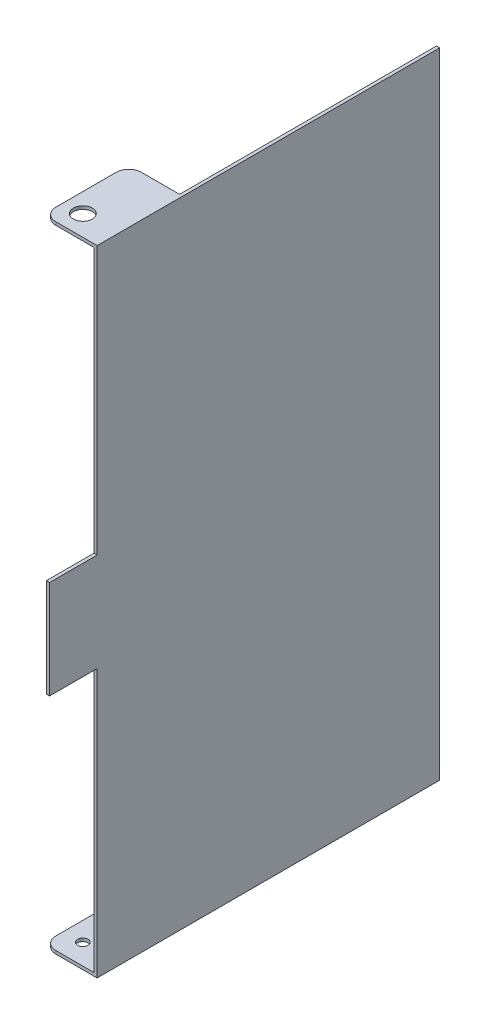
ISO-10303-21;
HEADER;
FILE_DESCRIPTION(('STEP AP214'),'2;1');
FILE_NAME('part.step','',(''),(''),'','','');
FILE_SCHEMA(('AUTOMOTIVE_DESIGN { 1 0 10303 214 1 1 1 1 }'));
ENDSEC;
DATA;
#1=APPLICATION_CONTEXT('core data for automotive mechanical design processes');
#2=APPLICATION_PROTOCOL_DEFINITION('international standard','automotive_design',2000,#1);
#3=PRODUCT_CONTEXT('',#1,'mechanical');
#4=PRODUCT('Part','Part','',(#3));
#5=PRODUCT_RELATED_PRODUCT_CATEGORY('part','',(#4));
#6=PRODUCT_DEFINITION_FORMATION('','',#4);
#7=PRODUCT_DEFINITION_CONTEXT('part definition',#1,'design');
#8=PRODUCT_DEFINITION('design','',#6,#7);
#9=PRODUCT_DEFINITION_SHAPE('','',#8);
#10=(LENGTH_UNIT() NAMED_UNIT(*) SI_UNIT(.MILLI.,.METRE.));
#11=(NAMED_UNIT(*) PLANE_ANGLE_UNIT() SI_UNIT($,.RADIAN.));
#12=(NAMED_UNIT(*) SI_UNIT($,.STERADIAN.) SOLID_ANGLE_UNIT());
#13=UNCERTAINTY_MEASURE_WITH_UNIT(LENGTH_MEASURE(1.E-05),#10,'distance_accuracy_value','');
#14=(GEOMETRIC_REPRESENTATION_CONTEXT(3) GLOBAL_UNCERTAINTY_ASSIGNED_CONTEXT((#13)) GLOBAL_UNIT_ASSIGNED_CONTEXT((#10,
#11,#12)) REPRESENTATION_CONTEXT('',''));
#15=CARTESIAN_POINT('',(0.,0.,0.));
#16=DIRECTION('',(0.,0.,1.));
#17=DIRECTION('',(1.,0.,0.));
#18=AXIS2_PLACEMENT_3D('',#15,#16,#17);
#19=CARTESIAN_POINT('',(-1.,-100.,54.));
#20=DIRECTION('',(0.,0.,1.));
#21=DIRECTION('',(1.,0.,0.));
#22=AXIS2_PLACEMENT_3D('',#19,#20,#21);
#23=PLANE('',#22);
#24=DIRECTION('',(-1.,0.,0.));
#25=VECTOR('',#24,1.);
#26=CARTESIAN_POINT('',(-1.,15.5,54.));
#27=LINE('',#26,#25);
#28=CARTESIAN_POINT('',(0.,15.5,54.));
#29=VERTEX_POINT('',#28);
#30=CARTESIAN_POINT('',(-1.,15.5,54.));
#31=VERTEX_POINT('',#30);
#32=EDGE_CURVE('E199',#29,#31,#27,.T.);
#33=ORIENTED_EDGE('',*,*,#32,.F.);
#34=DIRECTION('',(0.,-1.,0.));
#35=VECTOR('',#34,1.);
#36=CARTESIAN_POINT('',(0.,-100.,54.));
#37=LINE('',#36,#35);
#38=CARTESIAN_POINT('',(0.,100.,54.));
#39=VERTEX_POINT('',#38);
#40=EDGE_CURVE('E268',#39,#29,#37,.T.);
#41=ORIENTED_EDGE('',*,*,#40,.F.);
#42=DIRECTION('',(1.,0.,0.));
#43=VECTOR('',#42,1.);
#44=CARTESIAN_POINT('',(-1.,100.,54.));
#45=LINE('',#44,#43);
#46=CARTESIAN_POINT('',(-13.,100.,54.));
#47=VERTEX_POINT('',#46);
#48=EDGE_CURVE('E264',#47,#39,#45,.T.);
#49=ORIENTED_EDGE('',*,*,#48,.F.);
#50=DIRECTION('',(0.,1.,0.));
#51=VECTOR('',#50,1.);
#52=CARTESIAN_POINT('',(-13.,-100.,54.));
#53=LINE('',#52,#51);
#54=CARTESIAN_POINT('',(-13.,99.,54.));
#55=VERTEX_POINT('',#54);
#56=EDGE_CURVE('E300',#47,#55,#53,.F.);
#57=ORIENTED_EDGE('',*,*,#56,.T.);
#58=DIRECTION('',(1.,0.,0.));
#59=VECTOR('',#58,1.);
#60=CARTESIAN_POINT('',(-1.,99.,54.));
#61=LINE('',#60,#59);
#62=CARTESIAN_POINT('',(-1.,99.,54.));
#63=VERTEX_POINT('',#62);
#64=EDGE_CURVE('E244',#55,#63,#61,.T.);
#65=ORIENTED_EDGE('',*,*,#64,.T.);
#66=DIRECTION('',(0.,-1.,0.));
#67=VECTOR('',#66,1.);
#68=CARTESIAN_POINT('',(-1.,-100.,54.));
#69=LINE('',#68,#67);
#70=EDGE_CURVE('E64',#63,#31,#69,.T.);
#71=ORIENTED_EDGE('',*,*,#70,.T.);
#72=EDGE_LOOP('',(#33,#41,#49,#57,#65,#71));
#73=FACE_BOUND('',#72,.T.);
#74=ADVANCED_FACE('F41',(#73),#23,.T.);
#75=CARTESIAN_POINT('',(-1.,0.,0.));
#76=DIRECTION('',(1.,0.,0.));
#77=DIRECTION('',(0.,0.,-1.));
#78=AXIS2_PLACEMENT_3D('',#75,#76,#77);
#79=PLANE('',#78);
#80=DIRECTION('',(0.,0.,1.));
#81=VECTOR('',#80,1.);
#82=CARTESIAN_POINT('',(-1.,15.5,39.));
#83=LINE('',#82,#81);
#84=CARTESIAN_POINT('',(-1.,15.5,69.));
#85=VERTEX_POINT('',#84);
#86=EDGE_CURVE('E193',#31,#85,#83,.T.);
#87=ORIENTED_EDGE('',*,*,#86,.F.);
#88=ORIENTED_EDGE('',*,*,#70,.F.);
#89=DIRECTION('',(0.,0.,-1.));
#90=VECTOR('',#89,1.);
#91=CARTESIAN_POINT('',(-1.,99.,54.));
#92=LINE('',#91,#90);
#93=CARTESIAN_POINT('',(-1.,99.,27.));
#94=VERTEX_POINT('',#93);
#95=EDGE_CURVE('E234',#63,#94,#92,.T.);
#96=ORIENTED_EDGE('',*,*,#95,.T.);
#97=DIRECTION('',(0.,1.,0.));
#98=VECTOR('',#97,1.);
#99=CARTESIAN_POINT('',(-1.,99.,27.));
#100=LINE('',#99,#98);
#101=CARTESIAN_POINT('',(-1.,100.,27.));
#102=VERTEX_POINT('',#101);
#103=EDGE_CURVE('E246',#94,#102,#100,.T.);
#104=ORIENTED_EDGE('',*,*,#103,.T.);
#105=DIRECTION('',(0.,0.,1.));
#106=VECTOR('',#105,1.);
#107=CARTESIAN_POINT('',(-1.,100.,54.));
#108=LINE('',#107,#106);
#109=CARTESIAN_POINT('',(-1.,100.,-54.));
#110=VERTEX_POINT('',#109);
#111=EDGE_CURVE('E254',#110,#102,#108,.T.);
#112=ORIENTED_EDGE('',*,*,#111,.F.);
#113=DIRECTION('',(0.,1.,0.));
#114=VECTOR('',#113,1.);
#115=CARTESIAN_POINT('',(-1.,-100.,-54.));
#116=LINE('',#115,#114);
#117=CARTESIAN_POINT('',(-1.,-100.,-54.));
#118=VERTEX_POINT('',#117);
#119=EDGE_CURVE('E261',#118,#110,#116,.T.);
#120=ORIENTED_EDGE('',*,*,#119,.F.);
#121=DIRECTION('',(0.,0.,-1.));
#122=VECTOR('',#121,1.);
#123=CARTESIAN_POINT('',(-1.,-100.,54.));
#124=LINE('',#123,#122);
#125=CARTESIAN_POINT('',(-1.,-100.,27.));
#126=VERTEX_POINT('',#125);
#127=EDGE_CURVE('E259',#126,#118,#124,.T.);
#128=ORIENTED_EDGE('',*,*,#127,.F.);
#129=DIRECTION('',(0.,-1.,0.));
#130=VECTOR('',#129,1.);
#131=CARTESIAN_POINT('',(-1.,-99.,27.));
#132=LINE('',#131,#130);
#133=CARTESIAN_POINT('',(-1.,-99.,27.));
#134=VERTEX_POINT('',#133);
#135=EDGE_CURVE('E221',#134,#126,#132,.T.);
#136=ORIENTED_EDGE('',*,*,#135,.F.);
#137=DIRECTION('',(0.,0.,-1.));
#138=VECTOR('',#137,1.);
#139=CARTESIAN_POINT('',(-1.,-99.,54.));
#140=LINE('',#139,#138);
#141=CARTESIAN_POINT('',(-1.,-99.,54.));
#142=VERTEX_POINT('',#141);
#143=EDGE_CURVE('E208',#142,#134,#140,.T.);
#144=ORIENTED_EDGE('',*,*,#143,.F.);
#145=CARTESIAN_POINT('',(-1.,-15.5,54.));
#146=VERTEX_POINT('',#145);
#147=EDGE_CURVE('E173',#146,#142,#69,.T.);
#148=ORIENTED_EDGE('',*,*,#147,.F.);
#149=DIRECTION('',(0.,0.,1.));
#150=VECTOR('',#149,1.);
#151=CARTESIAN_POINT('',(-0.999999999999995,-15.5,39.));
#152=LINE('',#151,#150);
#153=CARTESIAN_POINT('',(-0.999999999999995,-15.5,69.));
#154=VERTEX_POINT('',#153);
#155=EDGE_CURVE('E165',#146,#154,#152,.T.);
#156=ORIENTED_EDGE('',*,*,#155,.T.);
#157=DIRECTION('',(0.,-1.,0.));
#158=VECTOR('',#157,1.);
#159=CARTESIAN_POINT('',(-1.,15.5,69.));
#160=LINE('',#159,#158);
#161=EDGE_CURVE('E170',#85,#154,#160,.T.);
#162=ORIENTED_EDGE('',*,*,#161,.F.);
#163=EDGE_LOOP('',(#87,#88,#96,#104,#112,#120,#128,#136,#144,#148,#156,#162));
#164=FACE_BOUND('',#163,.T.);
#165=ADVANCED_FACE('F168',(#164),#79,.F.);
#166=CARTESIAN_POINT('',(-1.,100.,54.));
#167=DIRECTION('',(0.,1.,0.));
#168=DIRECTION('',(0.,0.,1.));
#169=AXIS2_PLACEMENT_3D('',#166,#167,#168);
#170=PLANE('',#169);
#171=CARTESIAN_POINT('',(-11.,100.,47.5));
#172=DIRECTION('',(0.,1.,0.));
#173=DIRECTION('',(0.,0.,1.));
#174=AXIS2_PLACEMENT_3D('',#171,#172,#173);
#175=CIRCLE('',#174,3.);
#176=CARTESIAN_POINT('',(-11.,100.,50.5));
#177=VERTEX_POINT('',#176);
#178=EDGE_CURVE('E227',#177,#177,#175,.T.);
#179=ORIENTED_EDGE('',*,*,#178,.F.);
#180=EDGE_LOOP('',(#179));
#181=FACE_BOUND('',#180,.T.);
#182=DIRECTION('',(-1.,0.,0.));
#183=VECTOR('',#182,1.);
#184=CARTESIAN_POINT('',(-1.,100.,27.));
#185=LINE('',#184,#183);
#186=CARTESIAN_POINT('',(-13.,100.,27.));
#187=VERTEX_POINT('',#186);
#188=EDGE_CURVE('E233',#102,#187,#185,.T.);
#189=ORIENTED_EDGE('',*,*,#188,.T.);
#190=CARTESIAN_POINT('',(-13.,100.,31.));
#191=DIRECTION('',(0.,1.,0.));
#192=DIRECTION('',(0.,0.,1.));
#193=AXIS2_PLACEMENT_3D('',#190,#191,#192);
#194=CIRCLE('',#193,4.);
#195=CARTESIAN_POINT('',(-17.,100.,31.));
#196=VERTEX_POINT('',#195);
#197=EDGE_CURVE('E289',#187,#196,#194,.T.);
#198=ORIENTED_EDGE('',*,*,#197,.T.);
#199=DIRECTION('',(0.,0.,1.));
#200=VECTOR('',#199,1.);
#201=CARTESIAN_POINT('',(-17.,100.,54.));
#202=LINE('',#201,#200);
#203=CARTESIAN_POINT('',(-17.,100.,50.));
#204=VERTEX_POINT('',#203);
#205=EDGE_CURVE('E238',#196,#204,#202,.T.);
#206=ORIENTED_EDGE('',*,*,#205,.T.);
#207=CARTESIAN_POINT('',(-13.,100.,50.));
#208=DIRECTION('',(0.,1.,0.));
#209=DIRECTION('',(0.,0.,1.));
#210=AXIS2_PLACEMENT_3D('',#207,#208,#209);
#211=CIRCLE('',#210,4.);
#212=EDGE_CURVE('E287',#204,#47,#211,.T.);
#213=ORIENTED_EDGE('',*,*,#212,.T.);
#214=ORIENTED_EDGE('',*,*,#48,.T.);
#215=DIRECTION('',(0.,0.,1.));
#216=VECTOR('',#215,1.);
#217=CARTESIAN_POINT('',(0.,100.,54.));
#218=LINE('',#217,#216);
#219=CARTESIAN_POINT('',(0.,100.,-54.));
#220=VERTEX_POINT('',#219);
#221=EDGE_CURVE('E253',#220,#39,#218,.T.);
#222=ORIENTED_EDGE('',*,*,#221,.F.);
#223=DIRECTION('',(1.,0.,0.));
#224=VECTOR('',#223,1.);
#225=CARTESIAN_POINT('',(-1.,100.,-54.));
#226=LINE('',#225,#224);
#227=EDGE_CURVE('E276',#110,#220,#226,.T.);
#228=ORIENTED_EDGE('',*,*,#227,.F.);
#229=ORIENTED_EDGE('',*,*,#111,.T.);
#230=EDGE_LOOP('',(#189,#198,#206,#213,#214,#222,#228,#229));
#231=FACE_BOUND('',#230,.T.);
#232=ADVANCED_FACE('F369',(#181,#231),#170,.T.);
#233=CARTESIAN_POINT('',(-1.,-100.,-54.));
#234=DIRECTION('',(0.,0.,-1.));
#235=DIRECTION('',(-1.,0.,0.));
#236=AXIS2_PLACEMENT_3D('',#233,#234,#235);
#237=PLANE('',#236);
#238=DIRECTION('',(0.,1.,0.));
#239=VECTOR('',#238,1.);
#240=CARTESIAN_POINT('',(0.,-100.,-54.));
#241=LINE('',#240,#239);
#242=CARTESIAN_POINT('',(0.,-100.,-54.));
#243=VERTEX_POINT('',#242);
#244=EDGE_CURVE('E257',#243,#220,#241,.T.);
#245=ORIENTED_EDGE('',*,*,#244,.F.);
#246=DIRECTION('',(1.,0.,0.));
#247=VECTOR('',#246,1.);
#248=CARTESIAN_POINT('',(-1.,-100.,-54.));
#249=LINE('',#248,#247);
#250=EDGE_CURVE('E279',#118,#243,#249,.T.);
#251=ORIENTED_EDGE('',*,*,#250,.F.);
#252=ORIENTED_EDGE('',*,*,#119,.T.);
#253=ORIENTED_EDGE('',*,*,#227,.T.);
#254=EDGE_LOOP('',(#245,#251,#252,#253));
#255=FACE_BOUND('',#254,.T.);
#256=ADVANCED_FACE('F346',(#255),#237,.T.);
#257=CARTESIAN_POINT('',(-1.,-100.,54.));
#258=DIRECTION('',(0.,-1.,0.));
#259=DIRECTION('',(0.,0.,-1.));
#260=AXIS2_PLACEMENT_3D('',#257,#258,#259);
#261=PLANE('',#260);
#262=CARTESIAN_POINT('',(-11.,-100.,47.5));
#263=DIRECTION('',(0.,-1.,0.));
#264=DIRECTION('',(0.,0.,-1.));
#265=AXIS2_PLACEMENT_3D('',#262,#263,#264);
#266=CIRCLE('',#265,1.65);
#267=CARTESIAN_POINT('',(-11.,-100.,45.85));
#268=VERTEX_POINT('',#267);
#269=EDGE_CURVE('E201',#268,#268,#266,.T.);
#270=ORIENTED_EDGE('',*,*,#269,.F.);
#271=EDGE_LOOP('',(#270));
#272=FACE_BOUND('',#271,.T.);
#273=DIRECTION('',(1.,0.,0.));
#274=VECTOR('',#273,1.);
#275=CARTESIAN_POINT('',(-1.,-100.,54.));
#276=LINE('',#275,#274);
#277=CARTESIAN_POINT('',(-13.,-100.,54.));
#278=VERTEX_POINT('',#277);
#279=CARTESIAN_POINT('',(0.,-100.,54.));
#280=VERTEX_POINT('',#279);
#281=EDGE_CURVE('E281',#278,#280,#276,.T.);
#282=ORIENTED_EDGE('',*,*,#281,.F.);
#283=CARTESIAN_POINT('',(-13.,-100.,50.));
#284=DIRECTION('',(0.,-1.,0.));
#285=DIRECTION('',(0.,0.,-1.));
#286=AXIS2_PLACEMENT_3D('',#283,#284,#285);
#287=CIRCLE('',#286,4.);
#288=CARTESIAN_POINT('',(-17.,-100.,50.));
#289=VERTEX_POINT('',#288);
#290=EDGE_CURVE('E307',#278,#289,#287,.T.);
#291=ORIENTED_EDGE('',*,*,#290,.T.);
#292=DIRECTION('',(0.,0.,1.));
#293=VECTOR('',#292,1.);
#294=CARTESIAN_POINT('',(-17.,-100.,54.));
#295=LINE('',#294,#293);
#296=CARTESIAN_POINT('',(-17.,-100.,31.));
#297=VERTEX_POINT('',#296);
#298=EDGE_CURVE('E207',#297,#289,#295,.T.);
#299=ORIENTED_EDGE('',*,*,#298,.F.);
#300=CARTESIAN_POINT('',(-13.,-100.,31.));
#301=DIRECTION('',(0.,-1.,0.));
#302=DIRECTION('',(0.,0.,-1.));
#303=AXIS2_PLACEMENT_3D('',#300,#301,#302);
#304=CIRCLE('',#303,4.);
#305=CARTESIAN_POINT('',(-13.,-100.,27.));
#306=VERTEX_POINT('',#305);
#307=EDGE_CURVE('E305',#297,#306,#304,.T.);
#308=ORIENTED_EDGE('',*,*,#307,.T.);
#309=DIRECTION('',(-1.,0.,0.));
#310=VECTOR('',#309,1.);
#311=CARTESIAN_POINT('',(-1.,-100.,27.));
#312=LINE('',#311,#310);
#313=EDGE_CURVE('E212',#126,#306,#312,.T.);
#314=ORIENTED_EDGE('',*,*,#313,.F.);
#315=ORIENTED_EDGE('',*,*,#127,.T.);
#316=ORIENTED_EDGE('',*,*,#250,.T.);
#317=DIRECTION('',(0.,0.,-1.));
#318=VECTOR('',#317,1.);
#319=CARTESIAN_POINT('',(0.,-100.,54.));
#320=LINE('',#319,#318);
#321=EDGE_CURVE('E271',#280,#243,#320,.T.);
#322=ORIENTED_EDGE('',*,*,#321,.F.);
#323=EDGE_LOOP('',(#282,#291,#299,#308,#314,#315,#316,#322));
#324=FACE_BOUND('',#323,.T.);
#325=ADVANCED_FACE('F328',(#272,#324),#261,.T.);
#326=DIRECTION('',(1.,0.,0.));
#327=VECTOR('',#326,1.);
#328=CARTESIAN_POINT('',(-1.,-15.5,54.));
#329=LINE('',#328,#327);
#330=CARTESIAN_POINT('',(0.,-15.5,54.));
#331=VERTEX_POINT('',#330);
#332=EDGE_CURVE('E56',#146,#331,#329,.T.);
#333=ORIENTED_EDGE('',*,*,#332,.F.);
#334=ORIENTED_EDGE('',*,*,#147,.T.);
#335=DIRECTION('',(1.,0.,0.));
#336=VECTOR('',#335,1.);
#337=CARTESIAN_POINT('',(-1.,-99.,54.));
#338=LINE('',#337,#336);
#339=CARTESIAN_POINT('',(-13.,-99.,54.));
#340=VERTEX_POINT('',#339);
#341=EDGE_CURVE('E211',#340,#142,#338,.T.);
#342=ORIENTED_EDGE('',*,*,#341,.F.);
#343=DIRECTION('',(0.,-1.,0.));
#344=VECTOR('',#343,1.);
#345=CARTESIAN_POINT('',(-13.,-100.,54.));
#346=LINE('',#345,#344);
#347=EDGE_CURVE('E302',#340,#278,#346,.T.);
#348=ORIENTED_EDGE('',*,*,#347,.T.);
#349=ORIENTED_EDGE('',*,*,#281,.T.);
#350=EDGE_CURVE('E267',#331,#280,#37,.T.);
#351=ORIENTED_EDGE('',*,*,#350,.F.);
#352=EDGE_LOOP('',(#333,#334,#342,#348,#349,#351));
#353=FACE_BOUND('',#352,.T.);
#354=ADVANCED_FACE('F323',(#353),#23,.T.);
#355=CARTESIAN_POINT('',(0.,0.,0.));
#356=DIRECTION('',(1.,0.,0.));
#357=DIRECTION('',(0.,0.,-1.));
#358=AXIS2_PLACEMENT_3D('',#355,#356,#357);
#359=PLANE('',#358);
#360=ORIENTED_EDGE('',*,*,#40,.T.);
#361=DIRECTION('',(0.,0.,1.));
#362=VECTOR('',#361,1.);
#363=CARTESIAN_POINT('',(0.,15.5,39.));
#364=LINE('',#363,#362);
#365=CARTESIAN_POINT('',(0.,15.5,69.));
#366=VERTEX_POINT('',#365);
#367=EDGE_CURVE('E195',#29,#366,#364,.T.);
#368=ORIENTED_EDGE('',*,*,#367,.T.);
#369=DIRECTION('',(0.,1.,0.));
#370=VECTOR('',#369,1.);
#371=CARTESIAN_POINT('',(0.,15.5,69.));
#372=LINE('',#371,#370);
#373=CARTESIAN_POINT('',(0.,-15.5,69.));
#374=VERTEX_POINT('',#373);
#375=EDGE_CURVE('E185',#374,#366,#372,.T.);
#376=ORIENTED_EDGE('',*,*,#375,.F.);
#377=DIRECTION('',(0.,0.,1.));
#378=VECTOR('',#377,1.);
#379=CARTESIAN_POINT('',(0.,-15.5,39.));
#380=LINE('',#379,#378);
#381=EDGE_CURVE('E175',#331,#374,#380,.T.);
#382=ORIENTED_EDGE('',*,*,#381,.F.);
#383=ORIENTED_EDGE('',*,*,#350,.T.);
#384=ORIENTED_EDGE('',*,*,#321,.T.);
#385=ORIENTED_EDGE('',*,*,#244,.T.);
#386=ORIENTED_EDGE('',*,*,#221,.T.);
#387=EDGE_LOOP('',(#360,#368,#376,#382,#383,#384,#385,#386));
#388=FACE_BOUND('',#387,.T.);
#389=ADVANCED_FACE('F349',(#388),#359,.T.);
#390=CARTESIAN_POINT('',(-17.,99.,54.));
#391=DIRECTION('',(-1.,0.,0.));
#392=DIRECTION('',(0.,0.,1.));
#393=AXIS2_PLACEMENT_3D('',#390,#391,#392);
#394=PLANE('',#393);
#395=ORIENTED_EDGE('',*,*,#205,.F.);
#396=DIRECTION('',(0.,1.,0.));
#397=VECTOR('',#396,1.);
#398=CARTESIAN_POINT('',(-17.,99.,31.));
#399=LINE('',#398,#397);
#400=CARTESIAN_POINT('',(-17.,99.,31.));
#401=VERTEX_POINT('',#400);
#402=EDGE_CURVE('E294',#196,#401,#399,.F.);
#403=ORIENTED_EDGE('',*,*,#402,.T.);
#404=DIRECTION('',(0.,0.,1.));
#405=VECTOR('',#404,1.);
#406=CARTESIAN_POINT('',(-17.,99.,54.));
#407=LINE('',#406,#405);
#408=CARTESIAN_POINT('',(-17.,99.,50.));
#409=VERTEX_POINT('',#408);
#410=EDGE_CURVE('E241',#401,#409,#407,.T.);
#411=ORIENTED_EDGE('',*,*,#410,.T.);
#412=DIRECTION('',(0.,1.,0.));
#413=VECTOR('',#412,1.);
#414=CARTESIAN_POINT('',(-17.,99.,50.));
#415=LINE('',#414,#413);
#416=EDGE_CURVE('E291',#409,#204,#415,.T.);
#417=ORIENTED_EDGE('',*,*,#416,.T.);
#418=EDGE_LOOP('',(#395,#403,#411,#417));
#419=FACE_BOUND('',#418,.T.);
#420=ADVANCED_FACE('F371',(#419),#394,.T.);
#421=CARTESIAN_POINT('',(-1.,99.,27.));
#422=DIRECTION('',(0.,0.,-1.));
#423=DIRECTION('',(0.,1.,0.));
#424=AXIS2_PLACEMENT_3D('',#421,#422,#423);
#425=PLANE('',#424);
#426=DIRECTION('',(-1.,0.,0.));
#427=VECTOR('',#426,1.);
#428=CARTESIAN_POINT('',(-1.,99.,27.));
#429=LINE('',#428,#427);
#430=CARTESIAN_POINT('',(-13.,99.,27.));
#431=VERTEX_POINT('',#430);
#432=EDGE_CURVE('E237',#94,#431,#429,.T.);
#433=ORIENTED_EDGE('',*,*,#432,.T.);
#434=DIRECTION('',(0.,1.,0.));
#435=VECTOR('',#434,1.);
#436=CARTESIAN_POINT('',(-13.,99.,27.));
#437=LINE('',#436,#435);
#438=EDGE_CURVE('E278',#431,#187,#437,.T.);
#439=ORIENTED_EDGE('',*,*,#438,.T.);
#440=ORIENTED_EDGE('',*,*,#188,.F.);
#441=ORIENTED_EDGE('',*,*,#103,.F.);
#442=EDGE_LOOP('',(#433,#439,#440,#441));
#443=FACE_BOUND('',#442,.T.);
#444=ADVANCED_FACE('F363',(#443),#425,.T.);
#445=CARTESIAN_POINT('',(0.,99.0000000000001,0.));
#446=DIRECTION('',(0.,1.,0.));
#447=DIRECTION('',(0.,0.,1.));
#448=AXIS2_PLACEMENT_3D('',#445,#446,#447);
#449=PLANE('',#448);
#450=CARTESIAN_POINT('',(-11.,99.,47.5));
#451=DIRECTION('',(0.,1.,0.));
#452=DIRECTION('',(0.,0.,1.));
#453=AXIS2_PLACEMENT_3D('',#450,#451,#452);
#454=CIRCLE('',#453,3.);
#455=CARTESIAN_POINT('',(-11.,99.,50.5));
#456=VERTEX_POINT('',#455);
#457=EDGE_CURVE('E230',#456,#456,#454,.F.);
#458=ORIENTED_EDGE('',*,*,#457,.F.);
#459=EDGE_LOOP('',(#458));
#460=FACE_BOUND('',#459,.T.);
#461=ORIENTED_EDGE('',*,*,#410,.F.);
#462=CARTESIAN_POINT('',(-13.,99.,31.));
#463=DIRECTION('',(0.,1.,0.));
#464=DIRECTION('',(0.,0.,1.));
#465=AXIS2_PLACEMENT_3D('',#462,#463,#464);
#466=CIRCLE('',#465,4.);
#467=EDGE_CURVE('E298',#401,#431,#466,.F.);
#468=ORIENTED_EDGE('',*,*,#467,.T.);
#469=ORIENTED_EDGE('',*,*,#432,.F.);
#470=ORIENTED_EDGE('',*,*,#95,.F.);
#471=ORIENTED_EDGE('',*,*,#64,.F.);
#472=CARTESIAN_POINT('',(-13.,99.,50.));
#473=DIRECTION('',(0.,1.,0.));
#474=DIRECTION('',(0.,0.,1.));
#475=AXIS2_PLACEMENT_3D('',#472,#473,#474);
#476=CIRCLE('',#475,4.);
#477=EDGE_CURVE('E296',#55,#409,#476,.F.);
#478=ORIENTED_EDGE('',*,*,#477,.T.);
#479=EDGE_LOOP('',(#461,#468,#469,#470,#471,#478));
#480=FACE_BOUND('',#479,.T.);
#481=ADVANCED_FACE('F358',(#460,#480),#449,.F.);
#482=CARTESIAN_POINT('',(-11.,-100.001,47.4999999999999));
#483=DIRECTION('',(0.,1.,0.));
#484=DIRECTION('',(0.,0.,1.));
#485=AXIS2_PLACEMENT_3D('',#482,#483,#484);
#486=CYLINDRICAL_SURFACE('',#485,3.);
#487=ORIENTED_EDGE('',*,*,#178,.T.);
#488=EDGE_LOOP('',(#487));
#489=FACE_BOUND('',#488,.T.);
#490=ORIENTED_EDGE('',*,*,#457,.T.);
#491=EDGE_LOOP('',(#490));
#492=FACE_BOUND('',#491,.T.);
#493=ADVANCED_FACE('F408',(#489,#492),#486,.F.);
#494=CARTESIAN_POINT('',(-13.,99.,31.));
#495=DIRECTION('',(0.,1.,0.));
#496=DIRECTION('',(0.,0.,1.));
#497=AXIS2_PLACEMENT_3D('',#494,#495,#496);
#498=CYLINDRICAL_SURFACE('',#497,4.);
#499=ORIENTED_EDGE('',*,*,#467,.F.);
#500=ORIENTED_EDGE('',*,*,#402,.F.);
#501=ORIENTED_EDGE('',*,*,#197,.F.);
#502=ORIENTED_EDGE('',*,*,#438,.F.);
#503=EDGE_LOOP('',(#499,#500,#501,#502));
#504=FACE_BOUND('',#503,.T.);
#505=ADVANCED_FACE('F365',(#504),#498,.T.);
#506=CARTESIAN_POINT('',(-13.,99.,50.));
#507=DIRECTION('',(0.,1.,0.));
#508=DIRECTION('',(-1.,0.,0.));
#509=AXIS2_PLACEMENT_3D('',#506,#507,#508);
#510=CYLINDRICAL_SURFACE('',#509,4.);
#511=ORIENTED_EDGE('',*,*,#477,.F.);
#512=ORIENTED_EDGE('',*,*,#56,.F.);
#513=ORIENTED_EDGE('',*,*,#212,.F.);
#514=ORIENTED_EDGE('',*,*,#416,.F.);
#515=EDGE_LOOP('',(#511,#512,#513,#514));
#516=FACE_BOUND('',#515,.T.);
#517=ADVANCED_FACE('F374',(#516),#510,.T.);
#518=CARTESIAN_POINT('',(-1.,-99.,27.));
#519=DIRECTION('',(0.,0.,1.));
#520=DIRECTION('',(0.,-1.,0.));
#521=AXIS2_PLACEMENT_3D('',#518,#519,#520);
#522=PLANE('',#521);
#523=ORIENTED_EDGE('',*,*,#313,.T.);
#524=DIRECTION('',(0.,-1.,0.));
#525=VECTOR('',#524,1.);
#526=CARTESIAN_POINT('',(-13.,-99.,27.));
#527=LINE('',#526,#525);
#528=CARTESIAN_POINT('',(-13.,-99.,27.));
#529=VERTEX_POINT('',#528);
#530=EDGE_CURVE('E11',#306,#529,#527,.F.);
#531=ORIENTED_EDGE('',*,*,#530,.T.);
#532=DIRECTION('',(-1.,0.,0.));
#533=VECTOR('',#532,1.);
#534=CARTESIAN_POINT('',(-1.,-99.,27.));
#535=LINE('',#534,#533);
#536=EDGE_CURVE('E218',#134,#529,#535,.T.);
#537=ORIENTED_EDGE('',*,*,#536,.F.);
#538=ORIENTED_EDGE('',*,*,#135,.T.);
#539=EDGE_LOOP('',(#523,#531,#537,#538));
#540=FACE_BOUND('',#539,.T.);
#541=ADVANCED_FACE('F339',(#540),#522,.F.);
#542=CARTESIAN_POINT('',(-17.,-99.,54.));
#543=DIRECTION('',(1.,0.,0.));
#544=DIRECTION('',(0.,0.,-1.));
#545=AXIS2_PLACEMENT_3D('',#542,#543,#544);
#546=PLANE('',#545);
#547=ORIENTED_EDGE('',*,*,#298,.T.);
#548=DIRECTION('',(0.,-1.,0.));
#549=VECTOR('',#548,1.);
#550=CARTESIAN_POINT('',(-17.,-99.,50.));
#551=LINE('',#550,#549);
#552=CARTESIAN_POINT('',(-17.,-99.,50.));
#553=VERTEX_POINT('',#552);
#554=EDGE_CURVE('E312',#289,#553,#551,.F.);
#555=ORIENTED_EDGE('',*,*,#554,.T.);
#556=DIRECTION('',(0.,0.,1.));
#557=VECTOR('',#556,1.);
#558=CARTESIAN_POINT('',(-17.,-99.,54.));
#559=LINE('',#558,#557);
#560=CARTESIAN_POINT('',(-17.,-99.,31.));
#561=VERTEX_POINT('',#560);
#562=EDGE_CURVE('E215',#561,#553,#559,.T.);
#563=ORIENTED_EDGE('',*,*,#562,.F.);
#564=DIRECTION('',(0.,-1.,0.));
#565=VECTOR('',#564,1.);
#566=CARTESIAN_POINT('',(-17.,-99.,31.));
#567=LINE('',#566,#565);
#568=EDGE_CURVE('E309',#561,#297,#567,.T.);
#569=ORIENTED_EDGE('',*,*,#568,.T.);
#570=EDGE_LOOP('',(#547,#555,#563,#569));
#571=FACE_BOUND('',#570,.T.);
#572=ADVANCED_FACE('F331',(#571),#546,.F.);
#573=CARTESIAN_POINT('',(0.,-99.0000000000001,0.));
#574=DIRECTION('',(0.,-1.,0.));
#575=DIRECTION('',(0.,0.,1.));
#576=AXIS2_PLACEMENT_3D('',#573,#574,#575);
#577=PLANE('',#576);
#578=CARTESIAN_POINT('',(-11.,-99.,47.5));
#579=DIRECTION('',(0.,-1.,0.));
#580=DIRECTION('',(0.,0.,-1.));
#581=AXIS2_PLACEMENT_3D('',#578,#579,#580);
#582=CIRCLE('',#581,1.65);
#583=CARTESIAN_POINT('',(-11.,-99.,45.85));
#584=VERTEX_POINT('',#583);
#585=EDGE_CURVE('E204',#584,#584,#582,.F.);
#586=ORIENTED_EDGE('',*,*,#585,.F.);
#587=EDGE_LOOP('',(#586));
#588=FACE_BOUND('',#587,.T.);
#589=ORIENTED_EDGE('',*,*,#562,.T.);
#590=CARTESIAN_POINT('',(-13.,-99.,50.));
#591=DIRECTION('',(0.,-1.,0.));
#592=DIRECTION('',(0.,0.,-1.));
#593=AXIS2_PLACEMENT_3D('',#590,#591,#592);
#594=CIRCLE('',#593,4.);
#595=EDGE_CURVE('E49',#553,#340,#594,.F.);
#596=ORIENTED_EDGE('',*,*,#595,.T.);
#597=ORIENTED_EDGE('',*,*,#341,.T.);
#598=ORIENTED_EDGE('',*,*,#143,.T.);
#599=ORIENTED_EDGE('',*,*,#536,.T.);
#600=CARTESIAN_POINT('',(-13.,-99.,31.));
#601=DIRECTION('',(0.,-1.,0.));
#602=DIRECTION('',(0.,0.,-1.));
#603=AXIS2_PLACEMENT_3D('',#600,#601,#602);
#604=CIRCLE('',#603,4.);
#605=EDGE_CURVE('E314',#529,#561,#604,.F.);
#606=ORIENTED_EDGE('',*,*,#605,.T.);
#607=EDGE_LOOP('',(#589,#596,#597,#598,#599,#606));
#608=FACE_BOUND('',#607,.T.);
#609=ADVANCED_FACE('F318',(#588,#608),#577,.F.);
#610=CARTESIAN_POINT('',(-11.,100.001,47.5));
#611=DIRECTION('',(0.,-1.,0.));
#612=DIRECTION('',(0.,0.,-1.));
#613=AXIS2_PLACEMENT_3D('',#610,#611,#612);
#614=CYLINDRICAL_SURFACE('',#613,1.65);
#615=CARTESIAN_POINT('',(-11.,-100.,45.85));
#616=CARTESIAN_POINT('',(-11.,-99.9895833333333,45.85));
#617=CARTESIAN_POINT('',(-11.,-99.9791666666666,45.85));
#618=CARTESIAN_POINT('',(-11.,-99.9583333333333,45.85));
#619=CARTESIAN_POINT('',(-11.,-99.9479166666666,45.85));
#620=CARTESIAN_POINT('',(-11.,-99.9270833333333,45.85));
#621=CARTESIAN_POINT('',(-11.,-99.9166666666666,45.85));
#622=CARTESIAN_POINT('',(-11.,-99.8958333333333,45.85));
#623=CARTESIAN_POINT('',(-11.,-99.8854166666666,45.85));
#624=CARTESIAN_POINT('',(-11.,-99.8645833333333,45.85));
#625=CARTESIAN_POINT('',(-11.,-99.8541666666666,45.85));
#626=CARTESIAN_POINT('',(-11.,-99.8333333333333,45.85));
#627=CARTESIAN_POINT('',(-11.,-99.8229166666667,45.85));
#628=CARTESIAN_POINT('',(-11.,-99.8020833333333,45.85));
#629=CARTESIAN_POINT('',(-11.,-99.7916666666666,45.85));
#630=CARTESIAN_POINT('',(-11.,-99.7708333333333,45.85));
#631=CARTESIAN_POINT('',(-11.,-99.7604166666667,45.85));
#632=CARTESIAN_POINT('',(-11.,-99.7395833333333,45.85));
#633=CARTESIAN_POINT('',(-11.,-99.7291666666666,45.85));
#634=CARTESIAN_POINT('',(-11.,-99.7083333333333,45.85));
#635=CARTESIAN_POINT('',(-11.,-99.6979166666666,45.85));
#636=CARTESIAN_POINT('',(-11.,-99.6770833333333,45.85));
#637=CARTESIAN_POINT('',(-11.,-99.6666666666667,45.85));
#638=CARTESIAN_POINT('',(-11.,-99.6458333333333,45.85));
#639=CARTESIAN_POINT('',(-11.,-99.6354166666666,45.85));
#640=CARTESIAN_POINT('',(-11.,-99.6145833333333,45.85));
#641=CARTESIAN_POINT('',(-11.,-99.6041666666667,45.85));
#642=CARTESIAN_POINT('',(-11.,-99.5833333333333,45.85));
#643=CARTESIAN_POINT('',(-11.,-99.5729166666666,45.85));
#644=CARTESIAN_POINT('',(-11.,-99.5520833333333,45.85));
#645=CARTESIAN_POINT('',(-11.,-99.5416666666667,45.85));
#646=CARTESIAN_POINT('',(-11.,-99.5208333333333,45.85));
#647=CARTESIAN_POINT('',(-11.,-99.5104166666667,45.85));
#648=CARTESIAN_POINT('',(-11.,-99.4895833333333,45.85));
#649=CARTESIAN_POINT('',(-11.,-99.4791666666666,45.85));
#650=CARTESIAN_POINT('',(-11.,-99.4583333333333,45.85));
#651=CARTESIAN_POINT('',(-11.,-99.4479166666667,45.85));
#652=CARTESIAN_POINT('',(-11.,-99.4270833333333,45.85));
#653=CARTESIAN_POINT('',(-11.,-99.4166666666667,45.85));
#654=CARTESIAN_POINT('',(-11.,-99.3958333333333,45.85));
#655=CARTESIAN_POINT('',(-11.,-99.3854166666667,45.85));
#656=CARTESIAN_POINT('',(-11.,-99.3645833333333,45.85));
#657=CARTESIAN_POINT('',(-11.,-99.3541666666667,45.85));
#658=CARTESIAN_POINT('',(-11.,-99.3333333333333,45.85));
#659=CARTESIAN_POINT('',(-11.,-99.3229166666667,45.85));
#660=CARTESIAN_POINT('',(-11.,-99.3020833333333,45.85));
#661=CARTESIAN_POINT('',(-11.,-99.2916666666667,45.85));
#662=CARTESIAN_POINT('',(-11.,-99.2708333333333,45.85));
#663=CARTESIAN_POINT('',(-11.,-99.2604166666667,45.85));
#664=CARTESIAN_POINT('',(-11.,-99.2395833333333,45.85));
#665=CARTESIAN_POINT('',(-11.,-99.2291666666667,45.85));
#666=CARTESIAN_POINT('',(-11.,-99.2083333333333,45.85));
#667=CARTESIAN_POINT('',(-11.,-99.1979166666667,45.85));
#668=CARTESIAN_POINT('',(-11.,-99.1770833333333,45.85));
#669=CARTESIAN_POINT('',(-11.,-99.1666666666667,45.85));
#670=CARTESIAN_POINT('',(-11.,-99.1458333333333,45.85));
#671=CARTESIAN_POINT('',(-11.,-99.1354166666667,45.85));
#672=CARTESIAN_POINT('',(-11.,-99.1145833333333,45.85));
#673=CARTESIAN_POINT('',(-11.,-99.1041666666667,45.85));
#674=CARTESIAN_POINT('',(-11.,-99.0833333333334,45.85));
#675=CARTESIAN_POINT('',(-11.,-99.0729166666667,45.85));
#676=CARTESIAN_POINT('',(-11.,-99.0520833333333,45.85));
#677=CARTESIAN_POINT('',(-11.,-99.0416666666667,45.85));
#678=CARTESIAN_POINT('',(-11.,-99.0208333333334,45.85));
#679=CARTESIAN_POINT('',(-11.,-99.0104166666667,45.85));
#680=CARTESIAN_POINT('',(-11.,-99.,45.85));
#681=B_SPLINE_CURVE_WITH_KNOTS('',3,(#615,#616,#617,#618,#619,#620,#621,#622,#623,#624,#625,
#626,#627,#628,#629,#630,#631,#632,#633,#634,#635,#636,#637,#638,#639,#640,#641,#642,#643,#644,
#645,#646,#647,#648,#649,#650,#651,#652,#653,#654,#655,#656,#657,#658,#659,#660,#661,#662,#663,
#664,#665,#666,#667,#668,#669,#670,#671,#672,#673,#674,#675,#676,#677,#678,#679,#680),
.UNSPECIFIED.,.F.,.F.,(4,2,2,2,2,2,2,2,2,2,2,2,2,2,2,2,2,2,2,2,2,2,2,2,2,2,2,2,2,2,2,2,4),(0.,
0.0312500000000104,0.0624999999999931,0.0937500000000036,0.124999999999986,0.156249999999997,
0.187499999999979,0.21874999999999,0.249999999999972,0.281249999999983,0.312499999999993,
0.343749999999976,0.374999999999986,0.406249999999969,0.43749999999998,0.468749999999962,
0.499999999999973,0.531249999999983,0.562499999999966,0.593749999999976,0.624999999999959,
0.656249999999969,0.687499999999952,0.718749999999962,0.749999999999973,0.781249999999956,
0.812499999999966,0.843749999999949,0.874999999999959,0.906249999999942,0.937499999999952,
0.968749999999935,0.999999999999945),.UNSPECIFIED.);
#682=EDGE_CURVE('BSEAM418',#268,#584,#681,.T.);
#683=ORIENTED_EDGE('',*,*,#269,.T.);
#684=ORIENTED_EDGE('',*,*,#585,.T.);
#685=ORIENTED_EDGE('',*,*,#682,.T.);
#686=ORIENTED_EDGE('',*,*,#682,.F.);
#687=EDGE_LOOP('',(#683,#685,#684,#686));
#688=FACE_BOUND('',#687,.T.);
#689=ADVANCED_FACE('F418',(#688),#614,.F.);
#690=CARTESIAN_POINT('',(-13.,-100.,50.));
#691=DIRECTION('',(0.,1.,0.));
#692=DIRECTION('',(-1.,0.,0.));
#693=AXIS2_PLACEMENT_3D('',#690,#691,#692);
#694=CYLINDRICAL_SURFACE('',#693,4.);
#695=ORIENTED_EDGE('',*,*,#595,.F.);
#696=ORIENTED_EDGE('',*,*,#554,.F.);
#697=ORIENTED_EDGE('',*,*,#290,.F.);
#698=ORIENTED_EDGE('',*,*,#347,.F.);
#699=EDGE_LOOP('',(#695,#696,#697,#698));
#700=FACE_BOUND('',#699,.T.);
#701=ADVANCED_FACE('F325',(#700),#694,.T.);
#702=CARTESIAN_POINT('',(-13.,-99.,31.));
#703=DIRECTION('',(0.,-1.,0.));
#704=DIRECTION('',(0.,0.,-1.));
#705=AXIS2_PLACEMENT_3D('',#702,#703,#704);
#706=CYLINDRICAL_SURFACE('',#705,4.);
#707=ORIENTED_EDGE('',*,*,#605,.F.);
#708=ORIENTED_EDGE('',*,*,#530,.F.);
#709=ORIENTED_EDGE('',*,*,#307,.F.);
#710=ORIENTED_EDGE('',*,*,#568,.F.);
#711=EDGE_LOOP('',(#707,#708,#709,#710));
#712=FACE_BOUND('',#711,.T.);
#713=ADVANCED_FACE('F43',(#712),#706,.T.);
#714=CARTESIAN_POINT('',(-1.,15.5,39.));
#715=DIRECTION('',(0.,1.,0.));
#716=DIRECTION('',(0.,0.,1.));
#717=AXIS2_PLACEMENT_3D('',#714,#715,#716);
#718=PLANE('',#717);
#719=ORIENTED_EDGE('',*,*,#367,.F.);
#720=ORIENTED_EDGE('',*,*,#32,.T.);
#721=ORIENTED_EDGE('',*,*,#86,.T.);
#722=DIRECTION('',(-1.,0.,0.));
#723=VECTOR('',#722,1.);
#724=CARTESIAN_POINT('',(-1.,15.5,69.));
#725=LINE('',#724,#723);
#726=EDGE_CURVE('E176',#366,#85,#725,.T.);
#727=ORIENTED_EDGE('',*,*,#726,.F.);
#728=EDGE_LOOP('',(#719,#720,#721,#727));
#729=FACE_BOUND('',#728,.T.);
#730=ADVANCED_FACE('F352',(#729),#718,.T.);
#731=CARTESIAN_POINT('',(-0.999999999999995,-15.5,39.));
#732=DIRECTION('',(0.,-1.,0.));
#733=DIRECTION('',(0.,0.,-1.));
#734=AXIS2_PLACEMENT_3D('',#731,#732,#733);
#735=PLANE('',#734);
#736=ORIENTED_EDGE('',*,*,#155,.F.);
#737=ORIENTED_EDGE('',*,*,#332,.T.);
#738=ORIENTED_EDGE('',*,*,#381,.T.);
#739=DIRECTION('',(1.,0.,0.));
#740=VECTOR('',#739,1.);
#741=CARTESIAN_POINT('',(-0.999999999999995,-15.5,69.));
#742=LINE('',#741,#740);
#743=EDGE_CURVE('E179',#154,#374,#742,.T.);
#744=ORIENTED_EDGE('',*,*,#743,.F.);
#745=EDGE_LOOP('',(#736,#737,#738,#744));
#746=FACE_BOUND('',#745,.T.);
#747=ADVANCED_FACE('F180',(#746),#735,.T.);
#748=CARTESIAN_POINT('',(0.,0.,69.));
#749=DIRECTION('',(0.,0.,1.));
#750=DIRECTION('',(1.,0.,0.));
#751=AXIS2_PLACEMENT_3D('',#748,#749,#750);
#752=PLANE('',#751);
#753=ORIENTED_EDGE('',*,*,#161,.T.);
#754=ORIENTED_EDGE('',*,*,#743,.T.);
#755=ORIENTED_EDGE('',*,*,#375,.T.);
#756=ORIENTED_EDGE('',*,*,#726,.T.);
#757=EDGE_LOOP('',(#753,#754,#755,#756));
#758=FACE_BOUND('',#757,.T.);
#759=ADVANCED_FACE('F187',(#758),#752,.T.);
#760=CLOSED_SHELL('',(#74,#165,#232,#256,#325,#354,#389,#420,#444,#481,#493,#505,#517,#541,#572,
#609,#689,#701,#713,#730,#747,#759));
#761=MANIFOLD_SOLID_BREP('B2',#760);
#762=ADVANCED_BREP_SHAPE_REPRESENTATION('',(#18,#761),#14);
#763=SHAPE_DEFINITION_REPRESENTATION(#9,#762);
ENDSEC;
END-ISO-10303-21;
